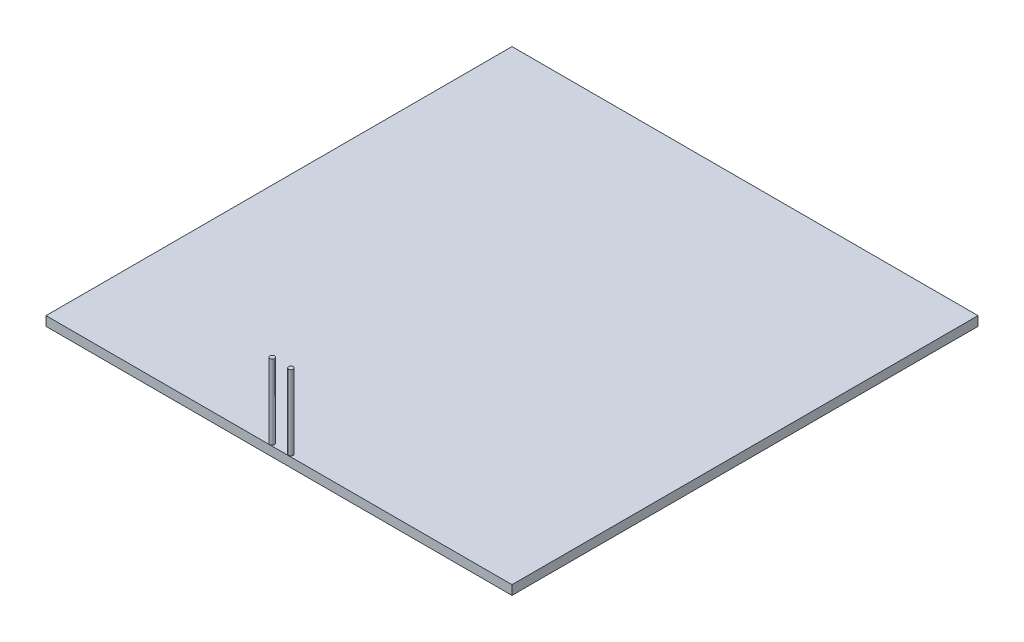
ISO-10303-21;
HEADER;
FILE_DESCRIPTION(('STEP AP214'),'2;1');
FILE_NAME('part.step','',(''),(''),'','','');
FILE_SCHEMA(('AUTOMOTIVE_DESIGN { 1 0 10303 214 1 1 1 1 }'));
ENDSEC;
DATA;
#1=APPLICATION_CONTEXT('core data for automotive mechanical design processes');
#2=APPLICATION_PROTOCOL_DEFINITION('international standard','automotive_design',2000,#1);
#3=PRODUCT_CONTEXT('',#1,'mechanical');
#4=PRODUCT('Part','Part','',(#3));
#5=PRODUCT_RELATED_PRODUCT_CATEGORY('part','',(#4));
#6=PRODUCT_DEFINITION_FORMATION('','',#4);
#7=PRODUCT_DEFINITION_CONTEXT('part definition',#1,'design');
#8=PRODUCT_DEFINITION('design','',#6,#7);
#9=PRODUCT_DEFINITION_SHAPE('','',#8);
#10=(LENGTH_UNIT() NAMED_UNIT(*) SI_UNIT(.MILLI.,.METRE.));
#11=(NAMED_UNIT(*) PLANE_ANGLE_UNIT() SI_UNIT($,.RADIAN.));
#12=(NAMED_UNIT(*) SI_UNIT($,.STERADIAN.) SOLID_ANGLE_UNIT());
#13=UNCERTAINTY_MEASURE_WITH_UNIT(LENGTH_MEASURE(1.E-05),#10,'distance_accuracy_value','');
#14=(GEOMETRIC_REPRESENTATION_CONTEXT(3) GLOBAL_UNCERTAINTY_ASSIGNED_CONTEXT((#13)) GLOBAL_UNIT_ASSIGNED_CONTEXT((#10,
#11,#12)) REPRESENTATION_CONTEXT('',''));
#15=CARTESIAN_POINT('',(0.,0.,0.));
#16=DIRECTION('',(0.,0.,1.));
#17=DIRECTION('',(1.,0.,0.));
#18=AXIS2_PLACEMENT_3D('',#15,#16,#17);
#19=CARTESIAN_POINT('',(-250.,10.,250.));
#20=DIRECTION('',(1.,0.,0.));
#21=DIRECTION('',(0.,0.,-1.));
#22=AXIS2_PLACEMENT_3D('',#19,#20,#21);
#23=PLANE('',#22);
#24=DIRECTION('',(0.,0.,1.));
#25=VECTOR('',#24,1.);
#26=CARTESIAN_POINT('',(-250.,0.,250.));
#27=LINE('',#26,#25);
#28=CARTESIAN_POINT('',(-250.,0.,-250.));
#29=VERTEX_POINT('',#28);
#30=CARTESIAN_POINT('',(-250.,0.,250.));
#31=VERTEX_POINT('',#30);
#32=EDGE_CURVE('E104',#29,#31,#27,.T.);
#33=ORIENTED_EDGE('',*,*,#32,.T.);
#34=DIRECTION('',(0.,-1.,0.));
#35=VECTOR('',#34,1.);
#36=CARTESIAN_POINT('',(-250.,10.,250.));
#37=LINE('',#36,#35);
#38=CARTESIAN_POINT('',(-250.,10.,250.));
#39=VERTEX_POINT('',#38);
#40=EDGE_CURVE('E11',#39,#31,#37,.T.);
#41=ORIENTED_EDGE('',*,*,#40,.F.);
#42=DIRECTION('',(0.,0.,1.));
#43=VECTOR('',#42,1.);
#44=CARTESIAN_POINT('',(-250.,10.,250.));
#45=LINE('',#44,#43);
#46=CARTESIAN_POINT('',(-250.,10.,-250.));
#47=VERTEX_POINT('',#46);
#48=EDGE_CURVE('E92',#47,#39,#45,.T.);
#49=ORIENTED_EDGE('',*,*,#48,.F.);
#50=DIRECTION('',(0.,-1.,0.));
#51=VECTOR('',#50,1.);
#52=CARTESIAN_POINT('',(-250.,10.,-250.));
#53=LINE('',#52,#51);
#54=EDGE_CURVE('E100',#47,#29,#53,.T.);
#55=ORIENTED_EDGE('',*,*,#54,.T.);
#56=EDGE_LOOP('',(#33,#41,#49,#55));
#57=FACE_BOUND('',#56,.T.);
#58=ADVANCED_FACE('F41',(#57),#23,.F.);
#59=CARTESIAN_POINT('',(250.,10.,250.));
#60=DIRECTION('',(0.,0.,-1.));
#61=DIRECTION('',(-1.,0.,0.));
#62=AXIS2_PLACEMENT_3D('',#59,#60,#61);
#63=PLANE('',#62);
#64=DIRECTION('',(1.,0.,0.));
#65=VECTOR('',#64,1.);
#66=CARTESIAN_POINT('',(250.,0.,250.));
#67=LINE('',#66,#65);
#68=CARTESIAN_POINT('',(250.,0.,250.));
#69=VERTEX_POINT('',#68);
#70=EDGE_CURVE('E96',#31,#69,#67,.T.);
#71=ORIENTED_EDGE('',*,*,#70,.T.);
#72=DIRECTION('',(0.,-1.,0.));
#73=VECTOR('',#72,1.);
#74=CARTESIAN_POINT('',(250.,10.,250.));
#75=LINE('',#74,#73);
#76=CARTESIAN_POINT('',(250.,10.,250.));
#77=VERTEX_POINT('',#76);
#78=EDGE_CURVE('E49',#77,#69,#75,.T.);
#79=ORIENTED_EDGE('',*,*,#78,.F.);
#80=DIRECTION('',(1.,0.,0.));
#81=VECTOR('',#80,1.);
#82=CARTESIAN_POINT('',(250.,10.,250.));
#83=LINE('',#82,#81);
#84=EDGE_CURVE('E87',#39,#77,#83,.T.);
#85=ORIENTED_EDGE('',*,*,#84,.F.);
#86=ORIENTED_EDGE('',*,*,#40,.T.);
#87=EDGE_LOOP('',(#71,#79,#85,#86));
#88=FACE_BOUND('',#87,.T.);
#89=ADVANCED_FACE('F95',(#88),#63,.F.);
#90=CARTESIAN_POINT('',(250.,10.,250.));
#91=DIRECTION('',(-1.,0.,0.));
#92=DIRECTION('',(0.,0.,1.));
#93=AXIS2_PLACEMENT_3D('',#90,#91,#92);
#94=PLANE('',#93);
#95=DIRECTION('',(0.,0.,-1.));
#96=VECTOR('',#95,1.);
#97=CARTESIAN_POINT('',(250.,0.,250.));
#98=LINE('',#97,#96);
#99=CARTESIAN_POINT('',(250.,0.,-250.));
#100=VERTEX_POINT('',#99);
#101=EDGE_CURVE('E74',#69,#100,#98,.T.);
#102=ORIENTED_EDGE('',*,*,#101,.T.);
#103=DIRECTION('',(0.,-1.,0.));
#104=VECTOR('',#103,1.);
#105=CARTESIAN_POINT('',(250.,10.,-250.));
#106=LINE('',#105,#104);
#107=CARTESIAN_POINT('',(250.,10.,-250.));
#108=VERTEX_POINT('',#107);
#109=EDGE_CURVE('E97',#108,#100,#106,.T.);
#110=ORIENTED_EDGE('',*,*,#109,.F.);
#111=DIRECTION('',(0.,0.,-1.));
#112=VECTOR('',#111,1.);
#113=CARTESIAN_POINT('',(250.,10.,250.));
#114=LINE('',#113,#112);
#115=EDGE_CURVE('E90',#77,#108,#114,.T.);
#116=ORIENTED_EDGE('',*,*,#115,.F.);
#117=ORIENTED_EDGE('',*,*,#78,.T.);
#118=EDGE_LOOP('',(#102,#110,#116,#117));
#119=FACE_BOUND('',#118,.T.);
#120=ADVANCED_FACE('F98',(#119),#94,.F.);
#121=CARTESIAN_POINT('',(250.,10.,-250.));
#122=DIRECTION('',(0.,0.,1.));
#123=DIRECTION('',(1.,0.,0.));
#124=AXIS2_PLACEMENT_3D('',#121,#122,#123);
#125=PLANE('',#124);
#126=DIRECTION('',(-1.,0.,0.));
#127=VECTOR('',#126,1.);
#128=CARTESIAN_POINT('',(250.,0.,-250.));
#129=LINE('',#128,#127);
#130=EDGE_CURVE('E80',#100,#29,#129,.T.);
#131=ORIENTED_EDGE('',*,*,#130,.T.);
#132=ORIENTED_EDGE('',*,*,#54,.F.);
#133=DIRECTION('',(-1.,0.,0.));
#134=VECTOR('',#133,1.);
#135=CARTESIAN_POINT('',(250.,10.,-250.));
#136=LINE('',#135,#134);
#137=EDGE_CURVE('E57',#108,#47,#136,.T.);
#138=ORIENTED_EDGE('',*,*,#137,.F.);
#139=ORIENTED_EDGE('',*,*,#109,.T.);
#140=EDGE_LOOP('',(#131,#132,#138,#139));
#141=FACE_BOUND('',#140,.T.);
#142=ADVANCED_FACE('F112',(#141),#125,.F.);
#143=CARTESIAN_POINT('',(0.,10.,0.));
#144=DIRECTION('',(0.,1.,0.));
#145=DIRECTION('',(0.,0.,1.));
#146=AXIS2_PLACEMENT_3D('',#143,#144,#145);
#147=PLANE('',#146);
#148=CARTESIAN_POINT('',(-9.9997752245612,10.,247.263176953089));
#149=DIRECTION('',(0.,1.,0.));
#150=DIRECTION('',(0.,0.,1.));
#151=AXIS2_PLACEMENT_3D('',#148,#149,#150);
#152=CIRCLE('',#151,2.47499999999998);
#153=CARTESIAN_POINT('',(-9.9997752245612,10.,249.738176953089));
#154=VERTEX_POINT('',#153);
#155=EDGE_CURVE('E124',#154,#154,#152,.T.);
#156=ORIENTED_EDGE('',*,*,#155,.F.);
#157=EDGE_LOOP('',(#156));
#158=FACE_BOUND('',#157,.T.);
#159=CARTESIAN_POINT('',(10.,10.,247.168356243179));
#160=DIRECTION('',(0.,1.,0.));
#161=DIRECTION('',(0.,0.,1.));
#162=AXIS2_PLACEMENT_3D('',#159,#160,#161);
#163=CIRCLE('',#162,2.47499999999999);
#164=CARTESIAN_POINT('',(10.,10.,249.643356243179));
#165=VERTEX_POINT('',#164);
#166=EDGE_CURVE('E121',#165,#165,#163,.T.);
#167=ORIENTED_EDGE('',*,*,#166,.F.);
#168=EDGE_LOOP('',(#167));
#169=FACE_BOUND('',#168,.T.);
#170=ORIENTED_EDGE('',*,*,#48,.T.);
#171=ORIENTED_EDGE('',*,*,#84,.T.);
#172=ORIENTED_EDGE('',*,*,#115,.T.);
#173=ORIENTED_EDGE('',*,*,#137,.T.);
#174=EDGE_LOOP('',(#170,#171,#172,#173));
#175=FACE_BOUND('',#174,.T.);
#176=ADVANCED_FACE('F88',(#158,#169,#175),#147,.T.);
#177=CARTESIAN_POINT('',(0.,0.,0.));
#178=DIRECTION('',(0.,1.,0.));
#179=DIRECTION('',(0.,0.,1.));
#180=AXIS2_PLACEMENT_3D('',#177,#178,#179);
#181=PLANE('',#180);
#182=ORIENTED_EDGE('',*,*,#32,.F.);
#183=ORIENTED_EDGE('',*,*,#130,.F.);
#184=ORIENTED_EDGE('',*,*,#101,.F.);
#185=ORIENTED_EDGE('',*,*,#70,.F.);
#186=EDGE_LOOP('',(#182,#183,#184,#185));
#187=FACE_BOUND('',#186,.T.);
#188=ADVANCED_FACE('F115',(#187),#181,.F.);
#189=CARTESIAN_POINT('',(10.,90.,247.168356243179));
#190=DIRECTION('',(0.,-1.,0.));
#191=DIRECTION('',(0.,0.,-1.));
#192=AXIS2_PLACEMENT_3D('',#189,#190,#191);
#193=CYLINDRICAL_SURFACE('',#192,2.47499999999999);
#194=CARTESIAN_POINT('',(10.,90.,247.168356243179));
#195=DIRECTION('',(0.,1.,0.));
#196=DIRECTION('',(0.,0.,1.));
#197=AXIS2_PLACEMENT_3D('',#194,#195,#196);
#198=CIRCLE('',#197,2.47499999999999);
#199=CARTESIAN_POINT('',(10.,90.,249.643356243179));
#200=VERTEX_POINT('',#199);
#201=EDGE_CURVE('E118',#200,#200,#198,.T.);
#202=ORIENTED_EDGE('',*,*,#201,.F.);
#203=EDGE_LOOP('',(#202));
#204=FACE_BOUND('',#203,.T.);
#205=ORIENTED_EDGE('',*,*,#166,.T.);
#206=EDGE_LOOP('',(#205));
#207=FACE_BOUND('',#206,.T.);
#208=ADVANCED_FACE('F144',(#204,#207),#193,.T.);
#209=CARTESIAN_POINT('',(10.,90.,247.168356243179));
#210=DIRECTION('',(0.,1.,0.));
#211=DIRECTION('',(0.,0.,1.));
#212=AXIS2_PLACEMENT_3D('',#209,#210,#211);
#213=PLANE('',#212);
#214=ORIENTED_EDGE('',*,*,#201,.T.);
#215=EDGE_LOOP('',(#214));
#216=FACE_BOUND('',#215,.T.);
#217=ADVANCED_FACE('F135',(#216),#213,.T.);
#218=CARTESIAN_POINT('',(-9.9997752245612,90.,247.263176953089));
#219=DIRECTION('',(0.,-1.,0.));
#220=DIRECTION('',(0.,0.,-1.));
#221=AXIS2_PLACEMENT_3D('',#218,#219,#220);
#222=CYLINDRICAL_SURFACE('',#221,2.47499999999998);
#223=CARTESIAN_POINT('',(-9.9997752245612,90.,247.263176953089));
#224=DIRECTION('',(0.,1.,0.));
#225=DIRECTION('',(0.,0.,1.));
#226=AXIS2_PLACEMENT_3D('',#223,#224,#225);
#227=CIRCLE('',#226,2.47499999999998);
#228=CARTESIAN_POINT('',(-9.9997752245612,90.,249.738176953089));
#229=VERTEX_POINT('',#228);
#230=EDGE_CURVE('E107',#229,#229,#227,.T.);
#231=ORIENTED_EDGE('',*,*,#230,.F.);
#232=EDGE_LOOP('',(#231));
#233=FACE_BOUND('',#232,.T.);
#234=ORIENTED_EDGE('',*,*,#155,.T.);
#235=EDGE_LOOP('',(#234));
#236=FACE_BOUND('',#235,.T.);
#237=ADVANCED_FACE('F132',(#233,#236),#222,.T.);
#238=CARTESIAN_POINT('',(-9.9997752245612,90.,247.263176953089));
#239=DIRECTION('',(0.,1.,0.));
#240=DIRECTION('',(0.,0.,1.));
#241=AXIS2_PLACEMENT_3D('',#238,#239,#240);
#242=PLANE('',#241);
#243=ORIENTED_EDGE('',*,*,#230,.T.);
#244=EDGE_LOOP('',(#243));
#245=FACE_BOUND('',#244,.T.);
#246=ADVANCED_FACE('F130',(#245),#242,.T.);
#247=CLOSED_SHELL('',(#58,#89,#120,#142,#176,#188,#208,#217,#237,#246));
#248=MANIFOLD_SOLID_BREP('B2',#247);
#249=ADVANCED_BREP_SHAPE_REPRESENTATION('',(#18,#248),#14);
#250=SHAPE_DEFINITION_REPRESENTATION(#9,#249);
ENDSEC;
END-ISO-10303-21;
